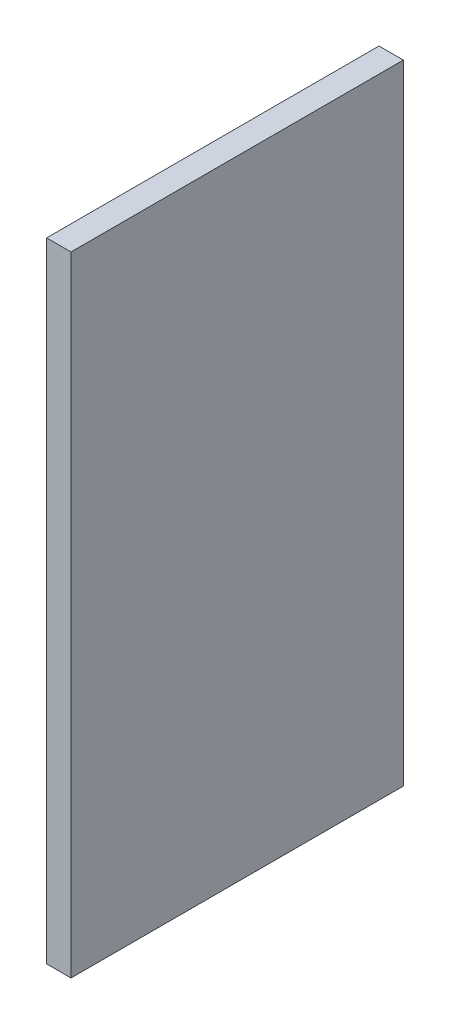
ISO-10303-21;
HEADER;
FILE_DESCRIPTION(('STEP AP214'),'2;1');
FILE_NAME('part.step','',(''),(''),'','','');
FILE_SCHEMA(('AUTOMOTIVE_DESIGN { 1 0 10303 214 1 1 1 1 }'));
ENDSEC;
DATA;
#1=APPLICATION_CONTEXT('core data for automotive mechanical design processes');
#2=APPLICATION_PROTOCOL_DEFINITION('international standard','automotive_design',2000,#1);
#3=PRODUCT_CONTEXT('',#1,'mechanical');
#4=PRODUCT('Part','Part','',(#3));
#5=PRODUCT_RELATED_PRODUCT_CATEGORY('part','',(#4));
#6=PRODUCT_DEFINITION_FORMATION('','',#4);
#7=PRODUCT_DEFINITION_CONTEXT('part definition',#1,'design');
#8=PRODUCT_DEFINITION('design','',#6,#7);
#9=PRODUCT_DEFINITION_SHAPE('','',#8);
#10=(LENGTH_UNIT() NAMED_UNIT(*) SI_UNIT(.MILLI.,.METRE.));
#11=(NAMED_UNIT(*) PLANE_ANGLE_UNIT() SI_UNIT($,.RADIAN.));
#12=(NAMED_UNIT(*) SI_UNIT($,.STERADIAN.) SOLID_ANGLE_UNIT());
#13=UNCERTAINTY_MEASURE_WITH_UNIT(LENGTH_MEASURE(1.E-05),#10,'distance_accuracy_value','');
#14=(GEOMETRIC_REPRESENTATION_CONTEXT(3) GLOBAL_UNCERTAINTY_ASSIGNED_CONTEXT((#13)) GLOBAL_UNIT_ASSIGNED_CONTEXT((#10,
#11,#12)) REPRESENTATION_CONTEXT('',''));
#15=CARTESIAN_POINT('',(0.,0.,0.));
#16=DIRECTION('',(0.,0.,1.));
#17=DIRECTION('',(1.,0.,0.));
#18=AXIS2_PLACEMENT_3D('',#15,#16,#17);
#19=CARTESIAN_POINT('',(1.5,121.5,-818.5));
#20=DIRECTION('',(-1.,0.,0.));
#21=DIRECTION('',(0.,0.,1.));
#22=AXIS2_PLACEMENT_3D('',#19,#20,#21);
#23=PLANE('',#22);
#24=DIRECTION('',(0.,-1.,0.));
#25=VECTOR('',#24,1.);
#26=CARTESIAN_POINT('',(1.5,121.5,0.));
#27=LINE('',#26,#25);
#28=CARTESIAN_POINT('',(1.5,1670.,0.));
#29=VERTEX_POINT('',#28);
#30=CARTESIAN_POINT('',(1.5,121.5,0.));
#31=VERTEX_POINT('',#30);
#32=EDGE_CURVE('E103',#29,#31,#27,.T.);
#33=ORIENTED_EDGE('',*,*,#32,.F.);
#34=DIRECTION('',(0.,0.,1.));
#35=VECTOR('',#34,1.);
#36=CARTESIAN_POINT('',(1.5,1670.,-818.5));
#37=LINE('',#36,#35);
#38=CARTESIAN_POINT('',(1.5,1670.,-818.5));
#39=VERTEX_POINT('',#38);
#40=EDGE_CURVE('E11',#39,#29,#37,.T.);
#41=ORIENTED_EDGE('',*,*,#40,.F.);
#42=DIRECTION('',(0.,-1.,0.));
#43=VECTOR('',#42,1.);
#44=CARTESIAN_POINT('',(1.5,121.5,-818.5));
#45=LINE('',#44,#43);
#46=CARTESIAN_POINT('',(1.5,121.5,-818.5));
#47=VERTEX_POINT('',#46);
#48=EDGE_CURVE('E97',#39,#47,#45,.T.);
#49=ORIENTED_EDGE('',*,*,#48,.T.);
#50=DIRECTION('',(0.,0.,1.));
#51=VECTOR('',#50,1.);
#52=CARTESIAN_POINT('',(1.5,121.5,-818.5));
#53=LINE('',#52,#51);
#54=EDGE_CURVE('E42',#47,#31,#53,.T.);
#55=ORIENTED_EDGE('',*,*,#54,.T.);
#56=EDGE_LOOP('',(#33,#41,#49,#55));
#57=FACE_BOUND('',#56,.T.);
#58=ADVANCED_FACE('F39',(#57),#23,.T.);
#59=CARTESIAN_POINT('',(1.5,1670.,-818.5));
#60=DIRECTION('',(0.,1.,0.));
#61=DIRECTION('',(0.,0.,1.));
#62=AXIS2_PLACEMENT_3D('',#59,#60,#61);
#63=PLANE('',#62);
#64=DIRECTION('',(-1.,0.,0.));
#65=VECTOR('',#64,1.);
#66=CARTESIAN_POINT('',(1.5,1670.,0.));
#67=LINE('',#66,#65);
#68=CARTESIAN_POINT('',(61.5,1670.,0.));
#69=VERTEX_POINT('',#68);
#70=EDGE_CURVE('E99',#69,#29,#67,.T.);
#71=ORIENTED_EDGE('',*,*,#70,.F.);
#72=DIRECTION('',(0.,0.,1.));
#73=VECTOR('',#72,1.);
#74=CARTESIAN_POINT('',(61.5,1670.,-818.5));
#75=LINE('',#74,#73);
#76=CARTESIAN_POINT('',(61.5,1670.,-818.5));
#77=VERTEX_POINT('',#76);
#78=EDGE_CURVE('E48',#77,#69,#75,.T.);
#79=ORIENTED_EDGE('',*,*,#78,.F.);
#80=DIRECTION('',(-1.,0.,0.));
#81=VECTOR('',#80,1.);
#82=CARTESIAN_POINT('',(1.5,1670.,-818.5));
#83=LINE('',#82,#81);
#84=EDGE_CURVE('E94',#77,#39,#83,.T.);
#85=ORIENTED_EDGE('',*,*,#84,.T.);
#86=ORIENTED_EDGE('',*,*,#40,.T.);
#87=EDGE_LOOP('',(#71,#79,#85,#86));
#88=FACE_BOUND('',#87,.T.);
#89=ADVANCED_FACE('F113',(#88),#63,.T.);
#90=CARTESIAN_POINT('',(61.5,121.5,-818.5));
#91=DIRECTION('',(1.,0.,0.));
#92=DIRECTION('',(0.,0.,-1.));
#93=AXIS2_PLACEMENT_3D('',#90,#91,#92);
#94=PLANE('',#93);
#95=DIRECTION('',(0.,1.,0.));
#96=VECTOR('',#95,1.);
#97=CARTESIAN_POINT('',(61.5,121.5,0.));
#98=LINE('',#97,#96);
#99=CARTESIAN_POINT('',(61.5,121.5,0.));
#100=VERTEX_POINT('',#99);
#101=EDGE_CURVE('E89',#100,#69,#98,.T.);
#102=ORIENTED_EDGE('',*,*,#101,.F.);
#103=DIRECTION('',(0.,0.,1.));
#104=VECTOR('',#103,1.);
#105=CARTESIAN_POINT('',(61.5,121.5,-818.5));
#106=LINE('',#105,#104);
#107=CARTESIAN_POINT('',(61.5,121.5,-818.5));
#108=VERTEX_POINT('',#107);
#109=EDGE_CURVE('E84',#108,#100,#106,.T.);
#110=ORIENTED_EDGE('',*,*,#109,.F.);
#111=DIRECTION('',(0.,1.,0.));
#112=VECTOR('',#111,1.);
#113=CARTESIAN_POINT('',(61.5,121.5,-818.5));
#114=LINE('',#113,#112);
#115=EDGE_CURVE('E87',#108,#77,#114,.T.);
#116=ORIENTED_EDGE('',*,*,#115,.T.);
#117=ORIENTED_EDGE('',*,*,#78,.T.);
#118=EDGE_LOOP('',(#102,#110,#116,#117));
#119=FACE_BOUND('',#118,.T.);
#120=ADVANCED_FACE('F86',(#119),#94,.T.);
#121=CARTESIAN_POINT('',(1.5,121.5,-818.5));
#122=DIRECTION('',(0.,-1.,0.));
#123=DIRECTION('',(0.,0.,-1.));
#124=AXIS2_PLACEMENT_3D('',#121,#122,#123);
#125=PLANE('',#124);
#126=DIRECTION('',(1.,0.,0.));
#127=VECTOR('',#126,1.);
#128=CARTESIAN_POINT('',(1.5,121.5,0.));
#129=LINE('',#128,#127);
#130=EDGE_CURVE('E106',#31,#100,#129,.T.);
#131=ORIENTED_EDGE('',*,*,#130,.F.);
#132=ORIENTED_EDGE('',*,*,#54,.F.);
#133=DIRECTION('',(1.,0.,0.));
#134=VECTOR('',#133,1.);
#135=CARTESIAN_POINT('',(1.5,121.5,-818.5));
#136=LINE('',#135,#134);
#137=EDGE_CURVE('E93',#47,#108,#136,.T.);
#138=ORIENTED_EDGE('',*,*,#137,.T.);
#139=ORIENTED_EDGE('',*,*,#109,.T.);
#140=EDGE_LOOP('',(#131,#132,#138,#139));
#141=FACE_BOUND('',#140,.T.);
#142=ADVANCED_FACE('F96',(#141),#125,.T.);
#143=CARTESIAN_POINT('',(0.,0.,-818.5));
#144=DIRECTION('',(0.,0.,-1.));
#145=DIRECTION('',(-1.,0.,0.));
#146=AXIS2_PLACEMENT_3D('',#143,#144,#145);
#147=PLANE('',#146);
#148=ORIENTED_EDGE('',*,*,#48,.F.);
#149=ORIENTED_EDGE('',*,*,#84,.F.);
#150=ORIENTED_EDGE('',*,*,#115,.F.);
#151=ORIENTED_EDGE('',*,*,#137,.F.);
#152=EDGE_LOOP('',(#148,#149,#150,#151));
#153=FACE_BOUND('',#152,.T.);
#154=ADVANCED_FACE('F92',(#153),#147,.T.);
#155=CARTESIAN_POINT('',(0.,0.,0.));
#156=DIRECTION('',(0.,0.,-1.));
#157=DIRECTION('',(-1.,0.,0.));
#158=AXIS2_PLACEMENT_3D('',#155,#156,#157);
#159=PLANE('',#158);
#160=ORIENTED_EDGE('',*,*,#32,.T.);
#161=ORIENTED_EDGE('',*,*,#130,.T.);
#162=ORIENTED_EDGE('',*,*,#101,.T.);
#163=ORIENTED_EDGE('',*,*,#70,.T.);
#164=EDGE_LOOP('',(#160,#161,#162,#163));
#165=FACE_BOUND('',#164,.T.);
#166=ADVANCED_FACE('F112',(#165),#159,.F.);
#167=CLOSED_SHELL('',(#58,#89,#120,#142,#154,#166));
#168=MANIFOLD_SOLID_BREP('B2',#167);
#169=ADVANCED_BREP_SHAPE_REPRESENTATION('',(#18,#168),#14);
#170=SHAPE_DEFINITION_REPRESENTATION(#9,#169);
ENDSEC;
END-ISO-10303-21;
